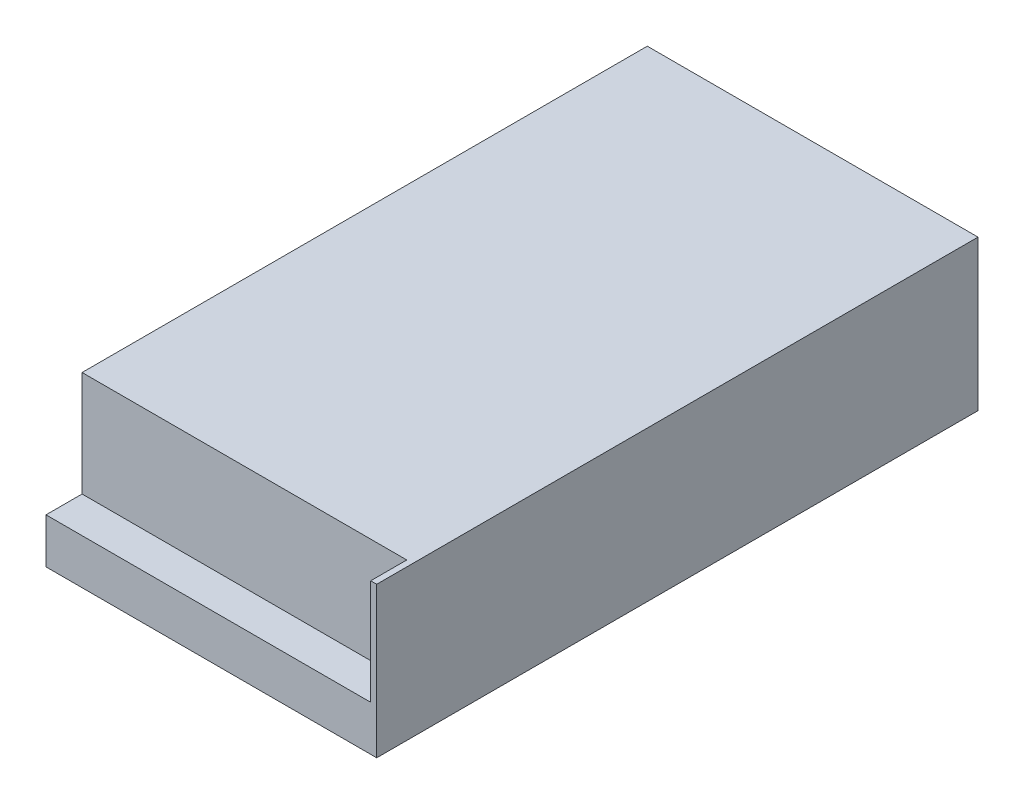
ISO-10303-21;
HEADER;
FILE_DESCRIPTION(('STEP AP214'),'2;1');
FILE_NAME('part.step','',(''),(''),'','','');
FILE_SCHEMA(('AUTOMOTIVE_DESIGN { 1 0 10303 214 1 1 1 1 }'));
ENDSEC;
DATA;
#1=APPLICATION_CONTEXT('core data for automotive mechanical design processes');
#2=APPLICATION_PROTOCOL_DEFINITION('international standard','automotive_design',2000,#1);
#3=PRODUCT_CONTEXT('',#1,'mechanical');
#4=PRODUCT('Part','Part','',(#3));
#5=PRODUCT_RELATED_PRODUCT_CATEGORY('part','',(#4));
#6=PRODUCT_DEFINITION_FORMATION('','',#4);
#7=PRODUCT_DEFINITION_CONTEXT('part definition',#1,'design');
#8=PRODUCT_DEFINITION('design','',#6,#7);
#9=PRODUCT_DEFINITION_SHAPE('','',#8);
#10=(LENGTH_UNIT() NAMED_UNIT(*) SI_UNIT(.MILLI.,.METRE.));
#11=(NAMED_UNIT(*) PLANE_ANGLE_UNIT() SI_UNIT($,.RADIAN.));
#12=(NAMED_UNIT(*) SI_UNIT($,.STERADIAN.) SOLID_ANGLE_UNIT());
#13=UNCERTAINTY_MEASURE_WITH_UNIT(LENGTH_MEASURE(1.E-05),#10,'distance_accuracy_value','');
#14=(GEOMETRIC_REPRESENTATION_CONTEXT(3) GLOBAL_UNCERTAINTY_ASSIGNED_CONTEXT((#13)) GLOBAL_UNIT_ASSIGNED_CONTEXT((#10,
#11,#12)) REPRESENTATION_CONTEXT('',''));
#15=CARTESIAN_POINT('',(0.,0.,0.));
#16=DIRECTION('',(0.,0.,1.));
#17=DIRECTION('',(1.,0.,0.));
#18=AXIS2_PLACEMENT_3D('',#15,#16,#17);
#19=CARTESIAN_POINT('',(55.,50.,100.));
#20=DIRECTION('',(-1.,0.,0.));
#21=DIRECTION('',(0.,0.,1.));
#22=AXIS2_PLACEMENT_3D('',#19,#20,#21);
#23=PLANE('',#22);
#24=DIRECTION('',(0.,0.,-1.));
#25=VECTOR('',#24,1.);
#26=CARTESIAN_POINT('',(55.,0.,100.));
#27=LINE('',#26,#25);
#28=CARTESIAN_POINT('',(55.,0.,100.));
#29=VERTEX_POINT('',#28);
#30=CARTESIAN_POINT('',(55.,0.,-100.));
#31=VERTEX_POINT('',#30);
#32=EDGE_CURVE('E134',#29,#31,#27,.T.);
#33=ORIENTED_EDGE('',*,*,#32,.T.);
#34=DIRECTION('',(0.,-1.,0.));
#35=VECTOR('',#34,1.);
#36=CARTESIAN_POINT('',(55.,50.,-100.));
#37=LINE('',#36,#35);
#38=CARTESIAN_POINT('',(55.,50.,-100.));
#39=VERTEX_POINT('',#38);
#40=EDGE_CURVE('E11',#39,#31,#37,.T.);
#41=ORIENTED_EDGE('',*,*,#40,.F.);
#42=DIRECTION('',(0.,0.,-1.));
#43=VECTOR('',#42,1.);
#44=CARTESIAN_POINT('',(55.,50.,100.));
#45=LINE('',#44,#43);
#46=CARTESIAN_POINT('',(55.,50.,100.));
#47=VERTEX_POINT('',#46);
#48=EDGE_CURVE('E130',#47,#39,#45,.T.);
#49=ORIENTED_EDGE('',*,*,#48,.F.);
#50=DIRECTION('',(0.,-1.,0.));
#51=VECTOR('',#50,1.);
#52=CARTESIAN_POINT('',(55.,50.,100.));
#53=LINE('',#52,#51);
#54=EDGE_CURVE('E125',#47,#29,#53,.T.);
#55=ORIENTED_EDGE('',*,*,#54,.T.);
#56=EDGE_LOOP('',(#33,#41,#49,#55));
#57=FACE_BOUND('',#56,.T.);
#58=ADVANCED_FACE('F36',(#57),#23,.F.);
#59=CARTESIAN_POINT('',(-55.,50.,-100.));
#60=DIRECTION('',(0.,0.,1.));
#61=DIRECTION('',(1.,0.,0.));
#62=AXIS2_PLACEMENT_3D('',#59,#60,#61);
#63=PLANE('',#62);
#64=DIRECTION('',(-1.,0.,0.));
#65=VECTOR('',#64,1.);
#66=CARTESIAN_POINT('',(-55.,0.,-100.));
#67=LINE('',#66,#65);
#68=CARTESIAN_POINT('',(-55.,0.,-100.));
#69=VERTEX_POINT('',#68);
#70=EDGE_CURVE('E132',#31,#69,#67,.T.);
#71=ORIENTED_EDGE('',*,*,#70,.T.);
#72=DIRECTION('',(0.,-1.,0.));
#73=VECTOR('',#72,1.);
#74=CARTESIAN_POINT('',(-55.,50.,-100.));
#75=LINE('',#74,#73);
#76=CARTESIAN_POINT('',(-55.,50.,-100.));
#77=VERTEX_POINT('',#76);
#78=EDGE_CURVE('E43',#77,#69,#75,.T.);
#79=ORIENTED_EDGE('',*,*,#78,.F.);
#80=DIRECTION('',(-1.,0.,0.));
#81=VECTOR('',#80,1.);
#82=CARTESIAN_POINT('',(-55.,50.,-100.));
#83=LINE('',#82,#81);
#84=EDGE_CURVE('E83',#39,#77,#83,.T.);
#85=ORIENTED_EDGE('',*,*,#84,.F.);
#86=ORIENTED_EDGE('',*,*,#40,.T.);
#87=EDGE_LOOP('',(#71,#79,#85,#86));
#88=FACE_BOUND('',#87,.T.);
#89=ADVANCED_FACE('F159',(#88),#63,.F.);
#90=CARTESIAN_POINT('',(-55.,50.,100.));
#91=DIRECTION('',(1.,0.,0.));
#92=DIRECTION('',(0.,0.,-1.));
#93=AXIS2_PLACEMENT_3D('',#90,#91,#92);
#94=PLANE('',#93);
#95=DIRECTION('',(0.,0.,1.));
#96=VECTOR('',#95,1.);
#97=CARTESIAN_POINT('',(-55.,15.,100.));
#98=LINE('',#97,#96);
#99=CARTESIAN_POINT('',(-55.,15.,88.));
#100=VERTEX_POINT('',#99);
#101=CARTESIAN_POINT('',(-55.,15.,100.));
#102=VERTEX_POINT('',#101);
#103=EDGE_CURVE('E104',#100,#102,#98,.T.);
#104=ORIENTED_EDGE('',*,*,#103,.F.);
#105=DIRECTION('',(0.,1.,0.));
#106=VECTOR('',#105,1.);
#107=CARTESIAN_POINT('',(-55.,15.,88.));
#108=LINE('',#107,#106);
#109=CARTESIAN_POINT('',(-55.,50.,88.));
#110=VERTEX_POINT('',#109);
#111=EDGE_CURVE('E137',#100,#110,#108,.T.);
#112=ORIENTED_EDGE('',*,*,#111,.T.);
#113=DIRECTION('',(0.,0.,1.));
#114=VECTOR('',#113,1.);
#115=CARTESIAN_POINT('',(-55.,50.,100.));
#116=LINE('',#115,#114);
#117=EDGE_CURVE('E139',#77,#110,#116,.T.);
#118=ORIENTED_EDGE('',*,*,#117,.F.);
#119=ORIENTED_EDGE('',*,*,#78,.T.);
#120=DIRECTION('',(0.,0.,1.));
#121=VECTOR('',#120,1.);
#122=CARTESIAN_POINT('',(-55.,0.,100.));
#123=LINE('',#122,#121);
#124=CARTESIAN_POINT('',(-55.,0.,100.));
#125=VERTEX_POINT('',#124);
#126=EDGE_CURVE('E124',#69,#125,#123,.T.);
#127=ORIENTED_EDGE('',*,*,#126,.T.);
#128=DIRECTION('',(0.,-1.,0.));
#129=VECTOR('',#128,1.);
#130=CARTESIAN_POINT('',(-55.,50.,100.));
#131=LINE('',#130,#129);
#132=EDGE_CURVE('E117',#102,#125,#131,.T.);
#133=ORIENTED_EDGE('',*,*,#132,.F.);
#134=EDGE_LOOP('',(#104,#112,#118,#119,#127,#133));
#135=FACE_BOUND('',#134,.T.);
#136=ADVANCED_FACE('F121',(#135),#94,.F.);
#137=CARTESIAN_POINT('',(-55.,50.,100.));
#138=DIRECTION('',(0.,0.,-1.));
#139=DIRECTION('',(-1.,0.,0.));
#140=AXIS2_PLACEMENT_3D('',#137,#138,#139);
#141=PLANE('',#140);
#142=DIRECTION('',(1.,0.,0.));
#143=VECTOR('',#142,1.);
#144=CARTESIAN_POINT('',(-55.,50.,100.));
#145=LINE('',#144,#143);
#146=CARTESIAN_POINT('',(53.,50.,100.));
#147=VERTEX_POINT('',#146);
#148=EDGE_CURVE('E58',#147,#47,#145,.T.);
#149=ORIENTED_EDGE('',*,*,#148,.F.);
#150=DIRECTION('',(0.,1.,0.));
#151=VECTOR('',#150,1.);
#152=CARTESIAN_POINT('',(53.,15.,100.));
#153=LINE('',#152,#151);
#154=CARTESIAN_POINT('',(53.,15.,100.));
#155=VERTEX_POINT('',#154);
#156=EDGE_CURVE('E50',#155,#147,#153,.T.);
#157=ORIENTED_EDGE('',*,*,#156,.F.);
#158=DIRECTION('',(1.,0.,0.));
#159=VECTOR('',#158,1.);
#160=CARTESIAN_POINT('',(-55.,15.,100.));
#161=LINE('',#160,#159);
#162=EDGE_CURVE('E108',#102,#155,#161,.T.);
#163=ORIENTED_EDGE('',*,*,#162,.F.);
#164=ORIENTED_EDGE('',*,*,#132,.T.);
#165=DIRECTION('',(1.,0.,0.));
#166=VECTOR('',#165,1.);
#167=CARTESIAN_POINT('',(-55.,0.,100.));
#168=LINE('',#167,#166);
#169=EDGE_CURVE('E78',#125,#29,#168,.T.);
#170=ORIENTED_EDGE('',*,*,#169,.T.);
#171=ORIENTED_EDGE('',*,*,#54,.F.);
#172=EDGE_LOOP('',(#149,#157,#163,#164,#170,#171));
#173=FACE_BOUND('',#172,.T.);
#174=ADVANCED_FACE('F116',(#173),#141,.F.);
#175=CARTESIAN_POINT('',(0.,50.,0.));
#176=DIRECTION('',(0.,-1.,0.));
#177=DIRECTION('',(0.,0.,-1.));
#178=AXIS2_PLACEMENT_3D('',#175,#176,#177);
#179=PLANE('',#178);
#180=ORIENTED_EDGE('',*,*,#117,.T.);
#181=DIRECTION('',(-1.,0.,0.));
#182=VECTOR('',#181,1.);
#183=CARTESIAN_POINT('',(-55.,50.,88.));
#184=LINE('',#183,#182);
#185=CARTESIAN_POINT('',(53.,50.,88.));
#186=VERTEX_POINT('',#185);
#187=EDGE_CURVE('E114',#186,#110,#184,.T.);
#188=ORIENTED_EDGE('',*,*,#187,.F.);
#189=DIRECTION('',(0.,0.,-1.));
#190=VECTOR('',#189,1.);
#191=CARTESIAN_POINT('',(53.,50.,100.));
#192=LINE('',#191,#190);
#193=EDGE_CURVE('E149',#147,#186,#192,.T.);
#194=ORIENTED_EDGE('',*,*,#193,.F.);
#195=ORIENTED_EDGE('',*,*,#148,.T.);
#196=ORIENTED_EDGE('',*,*,#48,.T.);
#197=ORIENTED_EDGE('',*,*,#84,.T.);
#198=EDGE_LOOP('',(#180,#188,#194,#195,#196,#197));
#199=FACE_BOUND('',#198,.T.);
#200=ADVANCED_FACE('F156',(#199),#179,.F.);
#201=CARTESIAN_POINT('',(0.,0.,0.));
#202=DIRECTION('',(0.,-1.,0.));
#203=DIRECTION('',(0.,0.,-1.));
#204=AXIS2_PLACEMENT_3D('',#201,#202,#203);
#205=PLANE('',#204);
#206=ORIENTED_EDGE('',*,*,#32,.F.);
#207=ORIENTED_EDGE('',*,*,#169,.F.);
#208=ORIENTED_EDGE('',*,*,#126,.F.);
#209=ORIENTED_EDGE('',*,*,#70,.F.);
#210=EDGE_LOOP('',(#206,#207,#208,#209));
#211=FACE_BOUND('',#210,.T.);
#212=ADVANCED_FACE('F162',(#211),#205,.T.);
#213=CARTESIAN_POINT('',(-55.,15.,88.));
#214=DIRECTION('',(0.,0.,-1.));
#215=DIRECTION('',(-1.,0.,0.));
#216=AXIS2_PLACEMENT_3D('',#213,#214,#215);
#217=PLANE('',#216);
#218=ORIENTED_EDGE('',*,*,#187,.T.);
#219=ORIENTED_EDGE('',*,*,#111,.F.);
#220=DIRECTION('',(-1.,0.,0.));
#221=VECTOR('',#220,1.);
#222=CARTESIAN_POINT('',(-55.,15.,88.));
#223=LINE('',#222,#221);
#224=CARTESIAN_POINT('',(53.,15.,88.));
#225=VERTEX_POINT('',#224);
#226=EDGE_CURVE('E110',#225,#100,#223,.T.);
#227=ORIENTED_EDGE('',*,*,#226,.F.);
#228=DIRECTION('',(0.,1.,0.));
#229=VECTOR('',#228,1.);
#230=CARTESIAN_POINT('',(53.,15.,88.));
#231=LINE('',#230,#229);
#232=EDGE_CURVE('E145',#225,#186,#231,.T.);
#233=ORIENTED_EDGE('',*,*,#232,.T.);
#234=EDGE_LOOP('',(#218,#219,#227,#233));
#235=FACE_BOUND('',#234,.T.);
#236=ADVANCED_FACE('F153',(#235),#217,.F.);
#237=CARTESIAN_POINT('',(53.,15.,100.));
#238=DIRECTION('',(1.,0.,0.));
#239=DIRECTION('',(0.,0.,-1.));
#240=AXIS2_PLACEMENT_3D('',#237,#238,#239);
#241=PLANE('',#240);
#242=ORIENTED_EDGE('',*,*,#193,.T.);
#243=ORIENTED_EDGE('',*,*,#232,.F.);
#244=DIRECTION('',(0.,0.,-1.));
#245=VECTOR('',#244,1.);
#246=CARTESIAN_POINT('',(53.,15.,100.));
#247=LINE('',#246,#245);
#248=EDGE_CURVE('E119',#155,#225,#247,.T.);
#249=ORIENTED_EDGE('',*,*,#248,.F.);
#250=ORIENTED_EDGE('',*,*,#156,.T.);
#251=EDGE_LOOP('',(#242,#243,#249,#250));
#252=FACE_BOUND('',#251,.T.);
#253=ADVANCED_FACE('F179',(#252),#241,.F.);
#254=CARTESIAN_POINT('',(0.,15.,0.));
#255=DIRECTION('',(0.,-1.,0.));
#256=DIRECTION('',(0.,0.,-1.));
#257=AXIS2_PLACEMENT_3D('',#254,#255,#256);
#258=PLANE('',#257);
#259=ORIENTED_EDGE('',*,*,#103,.T.);
#260=ORIENTED_EDGE('',*,*,#162,.T.);
#261=ORIENTED_EDGE('',*,*,#248,.T.);
#262=ORIENTED_EDGE('',*,*,#226,.T.);
#263=EDGE_LOOP('',(#259,#260,#261,#262));
#264=FACE_BOUND('',#263,.T.);
#265=ADVANCED_FACE('F106',(#264),#258,.F.);
#266=CLOSED_SHELL('',(#58,#89,#136,#174,#200,#212,#236,#253,#265));
#267=MANIFOLD_SOLID_BREP('B2',#266);
#268=ADVANCED_BREP_SHAPE_REPRESENTATION('',(#18,#267),#14);
#269=SHAPE_DEFINITION_REPRESENTATION(#9,#268);
ENDSEC;
END-ISO-10303-21;
